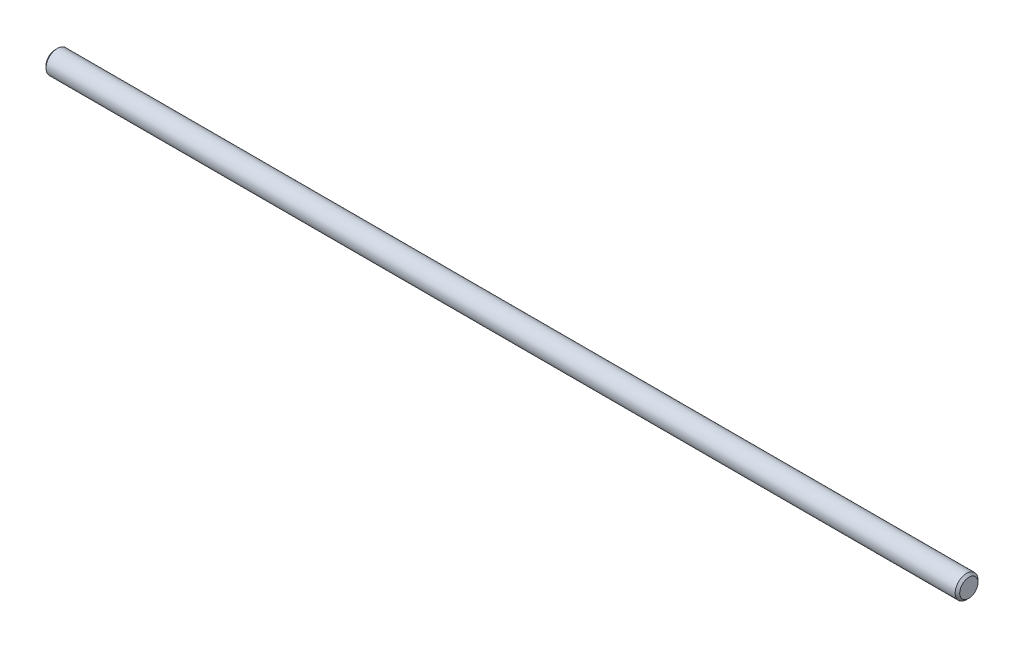
ISO-10303-21;
HEADER;
FILE_DESCRIPTION(('STEP AP214'),'2;1');
FILE_NAME('part.step','',(''),(''),'','','');
FILE_SCHEMA(('AUTOMOTIVE_DESIGN { 1 0 10303 214 1 1 1 1 }'));
ENDSEC;
DATA;
#1=APPLICATION_CONTEXT('core data for automotive mechanical design processes');
#2=APPLICATION_PROTOCOL_DEFINITION('international standard','automotive_design',2000,#1);
#3=PRODUCT_CONTEXT('',#1,'mechanical');
#4=PRODUCT('Part','Part','',(#3));
#5=PRODUCT_RELATED_PRODUCT_CATEGORY('part','',(#4));
#6=PRODUCT_DEFINITION_FORMATION('','',#4);
#7=PRODUCT_DEFINITION_CONTEXT('part definition',#1,'design');
#8=PRODUCT_DEFINITION('design','',#6,#7);
#9=PRODUCT_DEFINITION_SHAPE('','',#8);
#10=(LENGTH_UNIT() NAMED_UNIT(*) SI_UNIT(.MILLI.,.METRE.));
#11=(NAMED_UNIT(*) PLANE_ANGLE_UNIT() SI_UNIT($,.RADIAN.));
#12=(NAMED_UNIT(*) SI_UNIT($,.STERADIAN.) SOLID_ANGLE_UNIT());
#13=UNCERTAINTY_MEASURE_WITH_UNIT(LENGTH_MEASURE(1.E-05),#10,'distance_accuracy_value','');
#14=(GEOMETRIC_REPRESENTATION_CONTEXT(3) GLOBAL_UNCERTAINTY_ASSIGNED_CONTEXT((#13)) GLOBAL_UNIT_ASSIGNED_CONTEXT((#10,
#11,#12)) REPRESENTATION_CONTEXT('',''));
#15=CARTESIAN_POINT('',(0.,0.,0.));
#16=DIRECTION('',(0.,0.,1.));
#17=DIRECTION('',(1.,0.,0.));
#18=AXIS2_PLACEMENT_3D('',#15,#16,#17);
#19=CARTESIAN_POINT('',(-127.,0.,0.));
#20=DIRECTION('',(1.,0.,0.));
#21=DIRECTION('',(0.,0.,-1.));
#22=AXIS2_PLACEMENT_3D('',#19,#20,#21);
#23=CYLINDRICAL_SURFACE('',#22,3.175);
#24=CARTESIAN_POINT('',(126.365,0.,0.));
#25=DIRECTION('',(1.,0.,0.));
#26=DIRECTION('',(0.,0.,-1.));
#27=AXIS2_PLACEMENT_3D('',#24,#25,#26);
#28=CIRCLE('',#27,3.175);
#29=CARTESIAN_POINT('',(126.365,0.,-3.175));
#30=VERTEX_POINT('',#29);
#31=EDGE_CURVE('E42',#30,#30,#28,.F.);
#32=ORIENTED_EDGE('',*,*,#31,.T.);
#33=EDGE_LOOP('',(#32));
#34=FACE_BOUND('',#33,.T.);
#35=CARTESIAN_POINT('',(-126.365,0.,0.));
#36=DIRECTION('',(1.,0.,0.));
#37=DIRECTION('',(0.,0.,-1.));
#38=AXIS2_PLACEMENT_3D('',#35,#36,#37);
#39=CIRCLE('',#38,3.175);
#40=CARTESIAN_POINT('',(-126.365,0.,-3.175));
#41=VERTEX_POINT('',#40);
#42=EDGE_CURVE('E48',#41,#41,#39,.T.);
#43=ORIENTED_EDGE('',*,*,#42,.T.);
#44=EDGE_LOOP('',(#43));
#45=FACE_BOUND('',#44,.T.);
#46=ADVANCED_FACE('F34',(#34,#45),#23,.T.);
#47=CARTESIAN_POINT('',(-127.,0.,0.));
#48=DIRECTION('',(1.,0.,0.));
#49=DIRECTION('',(0.,0.,-1.));
#50=AXIS2_PLACEMENT_3D('',#47,#48,#49);
#51=PLANE('',#50);
#52=CARTESIAN_POINT('',(-127.,0.,0.));
#53=DIRECTION('',(1.,0.,0.));
#54=DIRECTION('',(0.,0.,-1.));
#55=AXIS2_PLACEMENT_3D('',#52,#53,#54);
#56=CIRCLE('',#55,2.54000000000004);
#57=CARTESIAN_POINT('',(-127.,0.,-2.54000000000004));
#58=VERTEX_POINT('',#57);
#59=EDGE_CURVE('E10',#58,#58,#56,.F.);
#60=ORIENTED_EDGE('',*,*,#59,.T.);
#61=EDGE_LOOP('',(#60));
#62=FACE_BOUND('',#61,.T.);
#63=ADVANCED_FACE('F69',(#62),#51,.F.);
#64=CARTESIAN_POINT('',(127.,0.,0.));
#65=DIRECTION('',(1.,0.,0.));
#66=DIRECTION('',(0.,0.,-1.));
#67=AXIS2_PLACEMENT_3D('',#64,#65,#66);
#68=PLANE('',#67);
#69=CARTESIAN_POINT('',(127.,0.,0.));
#70=DIRECTION('',(1.,0.,0.));
#71=DIRECTION('',(0.,0.,-1.));
#72=AXIS2_PLACEMENT_3D('',#69,#70,#71);
#73=CIRCLE('',#72,2.54000000000004);
#74=CARTESIAN_POINT('',(127.,0.,-2.54000000000004));
#75=VERTEX_POINT('',#74);
#76=EDGE_CURVE('E53',#75,#75,#73,.T.);
#77=ORIENTED_EDGE('',*,*,#76,.T.);
#78=EDGE_LOOP('',(#77));
#79=FACE_BOUND('',#78,.T.);
#80=ADVANCED_FACE('F59',(#79),#68,.T.);
#81=CARTESIAN_POINT('',(127.,0.,0.));
#82=DIRECTION('',(-1.,0.,0.));
#83=DIRECTION('',(0.,0.,1.));
#84=AXIS2_PLACEMENT_3D('',#81,#82,#83);
#85=CONICAL_SURFACE('',#84,2.54000000000004,0.785398163397462);
#86=ORIENTED_EDGE('',*,*,#31,.F.);
#87=EDGE_LOOP('',(#86));
#88=FACE_BOUND('',#87,.T.);
#89=ORIENTED_EDGE('',*,*,#76,.F.);
#90=EDGE_LOOP('',(#89));
#91=FACE_BOUND('',#90,.T.);
#92=ADVANCED_FACE('F61',(#88,#91),#85,.T.);
#93=CARTESIAN_POINT('',(-126.365,0.,0.));
#94=DIRECTION('',(1.,0.,0.));
#95=DIRECTION('',(0.,0.,-1.));
#96=AXIS2_PLACEMENT_3D('',#93,#94,#95);
#97=CONICAL_SURFACE('',#96,3.175,0.78539816339744);
#98=ORIENTED_EDGE('',*,*,#59,.F.);
#99=EDGE_LOOP('',(#98));
#100=FACE_BOUND('',#99,.T.);
#101=ORIENTED_EDGE('',*,*,#42,.F.);
#102=EDGE_LOOP('',(#101));
#103=FACE_BOUND('',#102,.T.);
#104=ADVANCED_FACE('F36',(#100,#103),#97,.T.);
#105=CLOSED_SHELL('',(#46,#63,#80,#92,#104));
#106=MANIFOLD_SOLID_BREP('B2',#105);
#107=ADVANCED_BREP_SHAPE_REPRESENTATION('',(#18,#106),#14);
#108=SHAPE_DEFINITION_REPRESENTATION(#9,#107);
ENDSEC;
END-ISO-10303-21;
